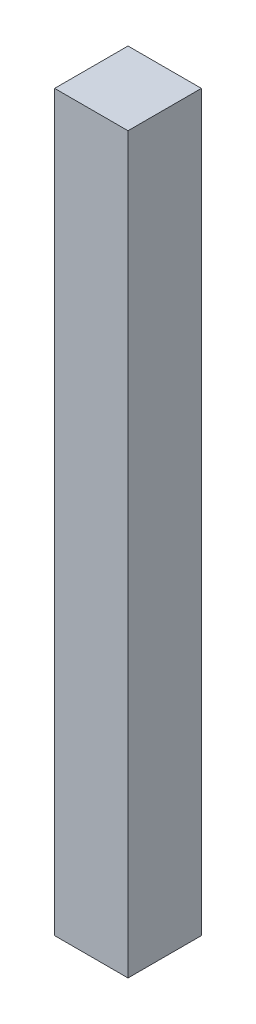
ISO-10303-21;
HEADER;
FILE_DESCRIPTION(('STEP AP214'),'2;1');
FILE_NAME('part.step','',(''),(''),'','','');
FILE_SCHEMA(('AUTOMOTIVE_DESIGN { 1 0 10303 214 1 1 1 1 }'));
ENDSEC;
DATA;
#1=APPLICATION_CONTEXT('core data for automotive mechanical design processes');
#2=APPLICATION_PROTOCOL_DEFINITION('international standard','automotive_design',2000,#1);
#3=PRODUCT_CONTEXT('',#1,'mechanical');
#4=PRODUCT('Part','Part','',(#3));
#5=PRODUCT_RELATED_PRODUCT_CATEGORY('part','',(#4));
#6=PRODUCT_DEFINITION_FORMATION('','',#4);
#7=PRODUCT_DEFINITION_CONTEXT('part definition',#1,'design');
#8=PRODUCT_DEFINITION('design','',#6,#7);
#9=PRODUCT_DEFINITION_SHAPE('','',#8);
#10=(LENGTH_UNIT() NAMED_UNIT(*) SI_UNIT(.MILLI.,.METRE.));
#11=(NAMED_UNIT(*) PLANE_ANGLE_UNIT() SI_UNIT($,.RADIAN.));
#12=(NAMED_UNIT(*) SI_UNIT($,.STERADIAN.) SOLID_ANGLE_UNIT());
#13=UNCERTAINTY_MEASURE_WITH_UNIT(LENGTH_MEASURE(1.E-05),#10,'distance_accuracy_value','');
#14=(GEOMETRIC_REPRESENTATION_CONTEXT(3) GLOBAL_UNCERTAINTY_ASSIGNED_CONTEXT((#13)) GLOBAL_UNIT_ASSIGNED_CONTEXT((#10,
#11,#12)) REPRESENTATION_CONTEXT('',''));
#15=CARTESIAN_POINT('',(0.,0.,0.));
#16=DIRECTION('',(0.,0.,1.));
#17=DIRECTION('',(1.,0.,0.));
#18=AXIS2_PLACEMENT_3D('',#15,#16,#17);
#19=CARTESIAN_POINT('',(25.4,508.,25.4));
#20=DIRECTION('',(-1.,0.,0.));
#21=DIRECTION('',(0.,0.,1.));
#22=AXIS2_PLACEMENT_3D('',#19,#20,#21);
#23=PLANE('',#22);
#24=DIRECTION('',(0.,0.,-1.));
#25=VECTOR('',#24,1.);
#26=CARTESIAN_POINT('',(25.4,0.,25.4));
#27=LINE('',#26,#25);
#28=CARTESIAN_POINT('',(25.4,0.,25.4));
#29=VERTEX_POINT('',#28);
#30=CARTESIAN_POINT('',(25.4,0.,-25.4));
#31=VERTEX_POINT('',#30);
#32=EDGE_CURVE('E107',#29,#31,#27,.T.);
#33=ORIENTED_EDGE('',*,*,#32,.T.);
#34=DIRECTION('',(0.,-1.,0.));
#35=VECTOR('',#34,1.);
#36=CARTESIAN_POINT('',(25.4,508.,-25.4));
#37=LINE('',#36,#35);
#38=CARTESIAN_POINT('',(25.4,508.,-25.4));
#39=VERTEX_POINT('',#38);
#40=EDGE_CURVE('E11',#39,#31,#37,.T.);
#41=ORIENTED_EDGE('',*,*,#40,.F.);
#42=DIRECTION('',(0.,0.,-1.));
#43=VECTOR('',#42,1.);
#44=CARTESIAN_POINT('',(25.4,508.,25.4));
#45=LINE('',#44,#43);
#46=CARTESIAN_POINT('',(25.4,508.,25.4));
#47=VERTEX_POINT('',#46);
#48=EDGE_CURVE('E91',#47,#39,#45,.T.);
#49=ORIENTED_EDGE('',*,*,#48,.F.);
#50=DIRECTION('',(0.,-1.,0.));
#51=VECTOR('',#50,1.);
#52=CARTESIAN_POINT('',(25.4,508.,25.4));
#53=LINE('',#52,#51);
#54=EDGE_CURVE('E103',#47,#29,#53,.T.);
#55=ORIENTED_EDGE('',*,*,#54,.T.);
#56=EDGE_LOOP('',(#33,#41,#49,#55));
#57=FACE_BOUND('',#56,.T.);
#58=ADVANCED_FACE('F39',(#57),#23,.F.);
#59=CARTESIAN_POINT('',(-25.4,508.,-25.4));
#60=DIRECTION('',(0.,0.,1.));
#61=DIRECTION('',(1.,0.,0.));
#62=AXIS2_PLACEMENT_3D('',#59,#60,#61);
#63=PLANE('',#62);
#64=DIRECTION('',(-1.,0.,0.));
#65=VECTOR('',#64,1.);
#66=CARTESIAN_POINT('',(-25.4,0.,-25.4));
#67=LINE('',#66,#65);
#68=CARTESIAN_POINT('',(-25.4,0.,-25.4));
#69=VERTEX_POINT('',#68);
#70=EDGE_CURVE('E96',#31,#69,#67,.T.);
#71=ORIENTED_EDGE('',*,*,#70,.T.);
#72=DIRECTION('',(0.,-1.,0.));
#73=VECTOR('',#72,1.);
#74=CARTESIAN_POINT('',(-25.4,508.,-25.4));
#75=LINE('',#74,#73);
#76=CARTESIAN_POINT('',(-25.4,508.,-25.4));
#77=VERTEX_POINT('',#76);
#78=EDGE_CURVE('E48',#77,#69,#75,.T.);
#79=ORIENTED_EDGE('',*,*,#78,.F.);
#80=DIRECTION('',(-1.,0.,0.));
#81=VECTOR('',#80,1.);
#82=CARTESIAN_POINT('',(-25.4,508.,-25.4));
#83=LINE('',#82,#81);
#84=EDGE_CURVE('E86',#39,#77,#83,.T.);
#85=ORIENTED_EDGE('',*,*,#84,.F.);
#86=ORIENTED_EDGE('',*,*,#40,.T.);
#87=EDGE_LOOP('',(#71,#79,#85,#86));
#88=FACE_BOUND('',#87,.T.);
#89=ADVANCED_FACE('F95',(#88),#63,.F.);
#90=CARTESIAN_POINT('',(-25.4,508.,25.4));
#91=DIRECTION('',(1.,0.,0.));
#92=DIRECTION('',(0.,0.,-1.));
#93=AXIS2_PLACEMENT_3D('',#90,#91,#92);
#94=PLANE('',#93);
#95=DIRECTION('',(0.,0.,1.));
#96=VECTOR('',#95,1.);
#97=CARTESIAN_POINT('',(-25.4,0.,25.4));
#98=LINE('',#97,#96);
#99=CARTESIAN_POINT('',(-25.4,0.,25.4));
#100=VERTEX_POINT('',#99);
#101=EDGE_CURVE('E73',#69,#100,#98,.T.);
#102=ORIENTED_EDGE('',*,*,#101,.T.);
#103=DIRECTION('',(0.,-1.,0.));
#104=VECTOR('',#103,1.);
#105=CARTESIAN_POINT('',(-25.4,508.,25.4));
#106=LINE('',#105,#104);
#107=CARTESIAN_POINT('',(-25.4,508.,25.4));
#108=VERTEX_POINT('',#107);
#109=EDGE_CURVE('E98',#108,#100,#106,.T.);
#110=ORIENTED_EDGE('',*,*,#109,.F.);
#111=DIRECTION('',(0.,0.,1.));
#112=VECTOR('',#111,1.);
#113=CARTESIAN_POINT('',(-25.4,508.,25.4));
#114=LINE('',#113,#112);
#115=EDGE_CURVE('E89',#77,#108,#114,.T.);
#116=ORIENTED_EDGE('',*,*,#115,.F.);
#117=ORIENTED_EDGE('',*,*,#78,.T.);
#118=EDGE_LOOP('',(#102,#110,#116,#117));
#119=FACE_BOUND('',#118,.T.);
#120=ADVANCED_FACE('F99',(#119),#94,.F.);
#121=CARTESIAN_POINT('',(-25.4,508.,25.4));
#122=DIRECTION('',(0.,0.,-1.));
#123=DIRECTION('',(-1.,0.,0.));
#124=AXIS2_PLACEMENT_3D('',#121,#122,#123);
#125=PLANE('',#124);
#126=DIRECTION('',(1.,0.,0.));
#127=VECTOR('',#126,1.);
#128=CARTESIAN_POINT('',(-25.4,0.,25.4));
#129=LINE('',#128,#127);
#130=EDGE_CURVE('E79',#100,#29,#129,.T.);
#131=ORIENTED_EDGE('',*,*,#130,.T.);
#132=ORIENTED_EDGE('',*,*,#54,.F.);
#133=DIRECTION('',(1.,0.,0.));
#134=VECTOR('',#133,1.);
#135=CARTESIAN_POINT('',(-25.4,508.,25.4));
#136=LINE('',#135,#134);
#137=EDGE_CURVE('E56',#108,#47,#136,.T.);
#138=ORIENTED_EDGE('',*,*,#137,.F.);
#139=ORIENTED_EDGE('',*,*,#109,.T.);
#140=EDGE_LOOP('',(#131,#132,#138,#139));
#141=FACE_BOUND('',#140,.T.);
#142=ADVANCED_FACE('F120',(#141),#125,.F.);
#143=CARTESIAN_POINT('',(0.,508.,0.));
#144=DIRECTION('',(0.,-1.,0.));
#145=DIRECTION('',(0.,0.,-1.));
#146=AXIS2_PLACEMENT_3D('',#143,#144,#145);
#147=PLANE('',#146);
#148=ORIENTED_EDGE('',*,*,#48,.T.);
#149=ORIENTED_EDGE('',*,*,#84,.T.);
#150=ORIENTED_EDGE('',*,*,#115,.T.);
#151=ORIENTED_EDGE('',*,*,#137,.T.);
#152=EDGE_LOOP('',(#148,#149,#150,#151));
#153=FACE_BOUND('',#152,.T.);
#154=ADVANCED_FACE('F87',(#153),#147,.F.);
#155=CARTESIAN_POINT('',(0.,0.,0.));
#156=DIRECTION('',(0.,-1.,0.));
#157=DIRECTION('',(0.,0.,-1.));
#158=AXIS2_PLACEMENT_3D('',#155,#156,#157);
#159=PLANE('',#158);
#160=ORIENTED_EDGE('',*,*,#32,.F.);
#161=ORIENTED_EDGE('',*,*,#130,.F.);
#162=ORIENTED_EDGE('',*,*,#101,.F.);
#163=ORIENTED_EDGE('',*,*,#70,.F.);
#164=EDGE_LOOP('',(#160,#161,#162,#163));
#165=FACE_BOUND('',#164,.T.);
#166=ADVANCED_FACE('F123',(#165),#159,.T.);
#167=CLOSED_SHELL('',(#58,#89,#120,#142,#154,#166));
#168=MANIFOLD_SOLID_BREP('B2',#167);
#169=ADVANCED_BREP_SHAPE_REPRESENTATION('',(#18,#168),#14);
#170=SHAPE_DEFINITION_REPRESENTATION(#9,#169);
ENDSEC;
END-ISO-10303-21;
